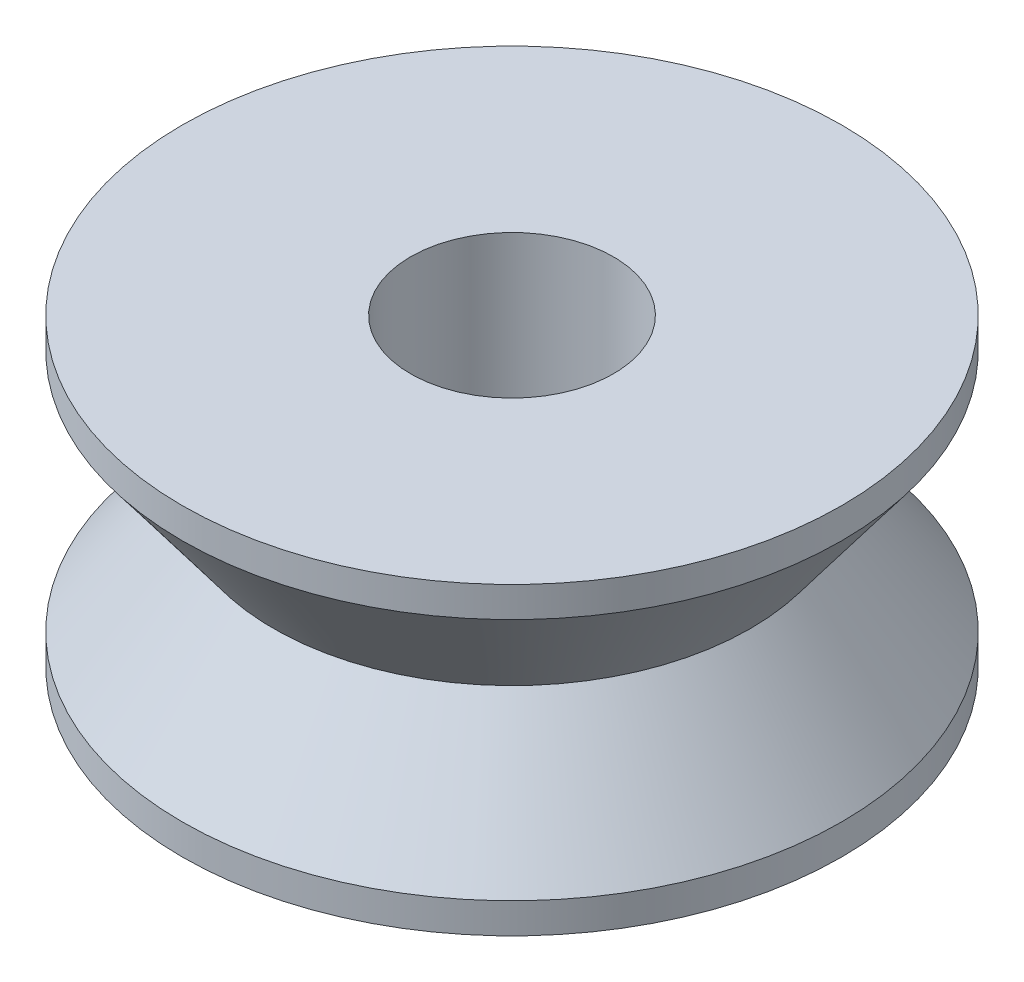
ISO-10303-21;
HEADER;
FILE_DESCRIPTION(('STEP AP214'),'2;1');
FILE_NAME('part.step','',(''),(''),'','','');
FILE_SCHEMA(('AUTOMOTIVE_DESIGN { 1 0 10303 214 1 1 1 1 }'));
ENDSEC;
DATA;
#1=APPLICATION_CONTEXT('core data for automotive mechanical design processes');
#2=APPLICATION_PROTOCOL_DEFINITION('international standard','automotive_design',2000,#1);
#3=PRODUCT_CONTEXT('',#1,'mechanical');
#4=PRODUCT('Part','Part','',(#3));
#5=PRODUCT_RELATED_PRODUCT_CATEGORY('part','',(#4));
#6=PRODUCT_DEFINITION_FORMATION('','',#4);
#7=PRODUCT_DEFINITION_CONTEXT('part definition',#1,'design');
#8=PRODUCT_DEFINITION('design','',#6,#7);
#9=PRODUCT_DEFINITION_SHAPE('','',#8);
#10=(LENGTH_UNIT() NAMED_UNIT(*) SI_UNIT(.MILLI.,.METRE.));
#11=(NAMED_UNIT(*) PLANE_ANGLE_UNIT() SI_UNIT($,.RADIAN.));
#12=(NAMED_UNIT(*) SI_UNIT($,.STERADIAN.) SOLID_ANGLE_UNIT());
#13=UNCERTAINTY_MEASURE_WITH_UNIT(LENGTH_MEASURE(1.E-05),#10,'distance_accuracy_value','');
#14=(GEOMETRIC_REPRESENTATION_CONTEXT(3) GLOBAL_UNCERTAINTY_ASSIGNED_CONTEXT((#13)) GLOBAL_UNIT_ASSIGNED_CONTEXT((#10,
#11,#12)) REPRESENTATION_CONTEXT('',''));
#15=CARTESIAN_POINT('',(0.,0.,0.));
#16=DIRECTION('',(0.,0.,1.));
#17=DIRECTION('',(1.,0.,0.));
#18=AXIS2_PLACEMENT_3D('',#15,#16,#17);
#19=CARTESIAN_POINT('',(0.,0.,0.));
#20=DIRECTION('',(0.,-1.,0.));
#21=DIRECTION('',(1.,0.,0.));
#22=AXIS2_PLACEMENT_3D('',#19,#20,#21);
#23=CONICAL_SURFACE('',#22,4.7,0.643501108793284);
#24=CARTESIAN_POINT('',(0.,-2.4,0.));
#25=DIRECTION('',(0.,-1.,0.));
#26=DIRECTION('',(1.,0.,0.));
#27=AXIS2_PLACEMENT_3D('',#24,#25,#26);
#28=CIRCLE('',#27,6.5);
#29=CARTESIAN_POINT('',(6.5,-2.4,0.));
#30=VERTEX_POINT('',#29);
#31=EDGE_CURVE('E60',#30,#30,#28,.T.);
#32=ORIENTED_EDGE('',*,*,#31,.F.);
#33=EDGE_LOOP('',(#32));
#34=FACE_BOUND('',#33,.T.);
#35=CARTESIAN_POINT('',(0.,0.,0.));
#36=DIRECTION('',(0.,-1.,0.));
#37=DIRECTION('',(1.,0.,0.));
#38=AXIS2_PLACEMENT_3D('',#35,#36,#37);
#39=CIRCLE('',#38,4.7);
#40=CARTESIAN_POINT('',(4.7,0.,0.));
#41=VERTEX_POINT('',#40);
#42=EDGE_CURVE('E10',#41,#41,#39,.T.);
#43=ORIENTED_EDGE('',*,*,#42,.T.);
#44=EDGE_LOOP('',(#43));
#45=FACE_BOUND('',#44,.T.);
#46=ADVANCED_FACE('F41',(#34,#45),#23,.T.);
#47=CARTESIAN_POINT('',(0.,2.4,0.));
#48=DIRECTION('',(0.,1.,0.));
#49=DIRECTION('',(-1.,0.,0.));
#50=AXIS2_PLACEMENT_3D('',#47,#48,#49);
#51=CONICAL_SURFACE('',#50,6.5,0.643501108793284);
#52=ORIENTED_EDGE('',*,*,#42,.F.);
#53=EDGE_LOOP('',(#52));
#54=FACE_BOUND('',#53,.T.);
#55=CARTESIAN_POINT('',(0.,2.4,0.));
#56=DIRECTION('',(0.,-1.,0.));
#57=DIRECTION('',(1.,0.,0.));
#58=AXIS2_PLACEMENT_3D('',#55,#56,#57);
#59=CIRCLE('',#58,6.5);
#60=CARTESIAN_POINT('',(6.5,2.4,0.));
#61=VERTEX_POINT('',#60);
#62=EDGE_CURVE('E48',#61,#61,#59,.T.);
#63=ORIENTED_EDGE('',*,*,#62,.T.);
#64=EDGE_LOOP('',(#63));
#65=FACE_BOUND('',#64,.T.);
#66=ADVANCED_FACE('F90',(#54,#65),#51,.T.);
#67=CARTESIAN_POINT('',(0.,-3.,0.));
#68=DIRECTION('',(0.,-1.,0.));
#69=DIRECTION('',(1.,0.,0.));
#70=AXIS2_PLACEMENT_3D('',#67,#68,#69);
#71=CYLINDRICAL_SURFACE('',#70,6.5);
#72=ORIENTED_EDGE('',*,*,#62,.F.);
#73=EDGE_LOOP('',(#72));
#74=FACE_BOUND('',#73,.T.);
#75=CARTESIAN_POINT('',(0.,3.,0.));
#76=DIRECTION('',(0.,-1.,0.));
#77=DIRECTION('',(1.,0.,0.));
#78=AXIS2_PLACEMENT_3D('',#75,#76,#77);
#79=CIRCLE('',#78,6.5);
#80=CARTESIAN_POINT('',(6.5,3.,0.));
#81=VERTEX_POINT('',#80);
#82=EDGE_CURVE('E52',#81,#81,#79,.T.);
#83=ORIENTED_EDGE('',*,*,#82,.T.);
#84=EDGE_LOOP('',(#83));
#85=FACE_BOUND('',#84,.T.);
#86=ADVANCED_FACE('F95',(#74,#85),#71,.T.);
#87=CARTESIAN_POINT('',(0.,3.,0.));
#88=DIRECTION('',(0.,-1.,0.));
#89=DIRECTION('',(1.,0.,0.));
#90=AXIS2_PLACEMENT_3D('',#87,#88,#89);
#91=PLANE('',#90);
#92=CARTESIAN_POINT('',(0.,3.,0.));
#93=DIRECTION('',(0.,1.,0.));
#94=DIRECTION('',(-1.,0.,0.));
#95=AXIS2_PLACEMENT_3D('',#92,#93,#94);
#96=CIRCLE('',#95,2.);
#97=CARTESIAN_POINT('',(-2.,3.,0.));
#98=VERTEX_POINT('',#97);
#99=EDGE_CURVE('E63',#98,#98,#96,.T.);
#100=ORIENTED_EDGE('',*,*,#99,.F.);
#101=EDGE_LOOP('',(#100));
#102=FACE_BOUND('',#101,.T.);
#103=ORIENTED_EDGE('',*,*,#82,.F.);
#104=EDGE_LOOP('',(#103));
#105=FACE_BOUND('',#104,.T.);
#106=ADVANCED_FACE('F76',(#102,#105),#91,.F.);
#107=CARTESIAN_POINT('',(0.,-3.,0.));
#108=DIRECTION('',(0.,-1.,0.));
#109=DIRECTION('',(1.,0.,0.));
#110=AXIS2_PLACEMENT_3D('',#107,#108,#109);
#111=PLANE('',#110);
#112=CARTESIAN_POINT('',(0.,-3.,0.));
#113=DIRECTION('',(0.,-1.,0.));
#114=DIRECTION('',(1.,0.,0.));
#115=AXIS2_PLACEMENT_3D('',#112,#113,#114);
#116=CIRCLE('',#115,2.);
#117=CARTESIAN_POINT('',(2.,-3.,0.));
#118=VERTEX_POINT('',#117);
#119=EDGE_CURVE('E44',#118,#118,#116,.T.);
#120=ORIENTED_EDGE('',*,*,#119,.F.);
#121=EDGE_LOOP('',(#120));
#122=FACE_BOUND('',#121,.T.);
#123=CARTESIAN_POINT('',(0.,-3.,0.));
#124=DIRECTION('',(0.,-1.,0.));
#125=DIRECTION('',(1.,0.,0.));
#126=AXIS2_PLACEMENT_3D('',#123,#124,#125);
#127=CIRCLE('',#126,6.5);
#128=CARTESIAN_POINT('',(6.5,-3.,0.));
#129=VERTEX_POINT('',#128);
#130=EDGE_CURVE('E57',#129,#129,#127,.T.);
#131=ORIENTED_EDGE('',*,*,#130,.T.);
#132=EDGE_LOOP('',(#131));
#133=FACE_BOUND('',#132,.T.);
#134=ADVANCED_FACE('F72',(#122,#133),#111,.T.);
#135=CARTESIAN_POINT('',(0.,-3.,0.));
#136=DIRECTION('',(0.,-1.,0.));
#137=DIRECTION('',(1.,0.,0.));
#138=AXIS2_PLACEMENT_3D('',#135,#136,#137);
#139=CYLINDRICAL_SURFACE('',#138,6.5);
#140=ORIENTED_EDGE('',*,*,#31,.T.);
#141=EDGE_LOOP('',(#140));
#142=FACE_BOUND('',#141,.T.);
#143=ORIENTED_EDGE('',*,*,#130,.F.);
#144=EDGE_LOOP('',(#143));
#145=FACE_BOUND('',#144,.T.);
#146=ADVANCED_FACE('F75',(#142,#145),#139,.T.);
#147=CARTESIAN_POINT('',(0.,-7.,0.));
#148=DIRECTION('',(0.,1.,0.));
#149=DIRECTION('',(-1.,0.,0.));
#150=AXIS2_PLACEMENT_3D('',#147,#148,#149);
#151=CYLINDRICAL_SURFACE('',#150,2.);
#152=ORIENTED_EDGE('',*,*,#119,.T.);
#153=EDGE_LOOP('',(#152));
#154=FACE_BOUND('',#153,.T.);
#155=ORIENTED_EDGE('',*,*,#99,.T.);
#156=EDGE_LOOP('',(#155));
#157=FACE_BOUND('',#156,.T.);
#158=ADVANCED_FACE('F70',(#154,#157),#151,.F.);
#159=CLOSED_SHELL('',(#46,#66,#86,#106,#134,#146,#158));
#160=MANIFOLD_SOLID_BREP('B2',#159);
#161=ADVANCED_BREP_SHAPE_REPRESENTATION('',(#18,#160),#14);
#162=SHAPE_DEFINITION_REPRESENTATION(#9,#161);
ENDSEC;
END-ISO-10303-21;
